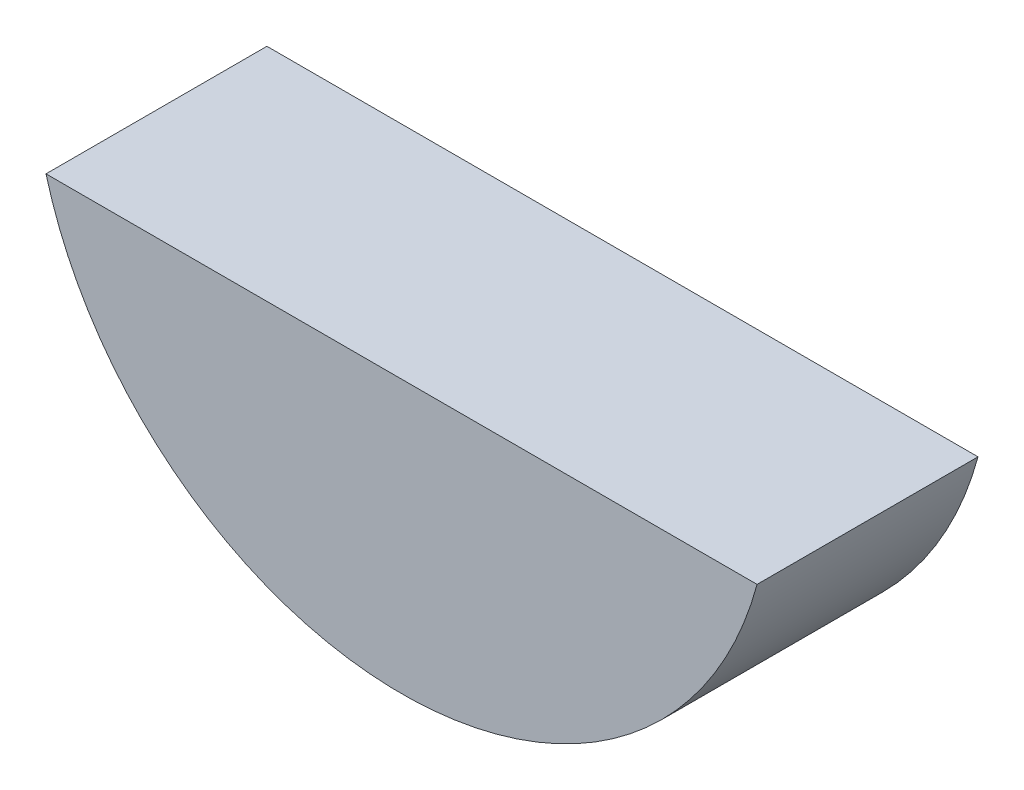
ISO-10303-21;
HEADER;
FILE_DESCRIPTION(('STEP AP214'),'2;1');
FILE_NAME('part.step','',(''),(''),'','','');
FILE_SCHEMA(('AUTOMOTIVE_DESIGN { 1 0 10303 214 1 1 1 1 }'));
ENDSEC;
DATA;
#1=APPLICATION_CONTEXT('core data for automotive mechanical design processes');
#2=APPLICATION_PROTOCOL_DEFINITION('international standard','automotive_design',2000,#1);
#3=PRODUCT_CONTEXT('',#1,'mechanical');
#4=PRODUCT('Part','Part','',(#3));
#5=PRODUCT_RELATED_PRODUCT_CATEGORY('part','',(#4));
#6=PRODUCT_DEFINITION_FORMATION('','',#4);
#7=PRODUCT_DEFINITION_CONTEXT('part definition',#1,'design');
#8=PRODUCT_DEFINITION('design','',#6,#7);
#9=PRODUCT_DEFINITION_SHAPE('','',#8);
#10=(LENGTH_UNIT() NAMED_UNIT(*) SI_UNIT(.MILLI.,.METRE.));
#11=(NAMED_UNIT(*) PLANE_ANGLE_UNIT() SI_UNIT($,.RADIAN.));
#12=(NAMED_UNIT(*) SI_UNIT($,.STERADIAN.) SOLID_ANGLE_UNIT());
#13=UNCERTAINTY_MEASURE_WITH_UNIT(LENGTH_MEASURE(1.E-05),#10,'distance_accuracy_value','');
#14=(GEOMETRIC_REPRESENTATION_CONTEXT(3) GLOBAL_UNCERTAINTY_ASSIGNED_CONTEXT((#13)) GLOBAL_UNIT_ASSIGNED_CONTEXT((#10,
#11,#12)) REPRESENTATION_CONTEXT('',''));
#15=CARTESIAN_POINT('',(0.,0.,0.));
#16=DIRECTION('',(0.,0.,1.));
#17=DIRECTION('',(1.,0.,0.));
#18=AXIS2_PLACEMENT_3D('',#15,#16,#17);
#19=CARTESIAN_POINT('',(0.,1.3,1.5));
#20=DIRECTION('',(0.,0.,-1.));
#21=DIRECTION('',(-1.,0.,0.));
#22=AXIS2_PLACEMENT_3D('',#19,#20,#21);
#23=CYLINDRICAL_SURFACE('',#22,5.);
#24=CARTESIAN_POINT('',(0.,1.3,-1.5));
#25=DIRECTION('',(0.,0.,1.));
#26=DIRECTION('',(1.,0.,0.));
#27=AXIS2_PLACEMENT_3D('',#24,#25,#26);
#28=CIRCLE('',#27,5.);
#29=CARTESIAN_POINT('',(-4.82804308182932,0.,-1.5));
#30=VERTEX_POINT('',#29);
#31=CARTESIAN_POINT('',(4.82804308182932,0.,-1.5));
#32=VERTEX_POINT('',#31);
#33=EDGE_CURVE('E56',#30,#32,#28,.T.);
#34=ORIENTED_EDGE('',*,*,#33,.T.);
#35=DIRECTION('',(0.,0.,-1.));
#36=VECTOR('',#35,1.);
#37=CARTESIAN_POINT('',(4.82804308182932,0.,1.5));
#38=LINE('',#37,#36);
#39=CARTESIAN_POINT('',(4.82804308182932,0.,1.5));
#40=VERTEX_POINT('',#39);
#41=EDGE_CURVE('E11',#40,#32,#38,.T.);
#42=ORIENTED_EDGE('',*,*,#41,.F.);
#43=CARTESIAN_POINT('',(0.,1.3,1.5));
#44=DIRECTION('',(0.,0.,1.));
#45=DIRECTION('',(1.,0.,0.));
#46=AXIS2_PLACEMENT_3D('',#43,#44,#45);
#47=CIRCLE('',#46,5.);
#48=CARTESIAN_POINT('',(-4.82804308182932,0.,1.5));
#49=VERTEX_POINT('',#48);
#50=EDGE_CURVE('E58',#49,#40,#47,.T.);
#51=ORIENTED_EDGE('',*,*,#50,.F.);
#52=DIRECTION('',(0.,0.,-1.));
#53=VECTOR('',#52,1.);
#54=CARTESIAN_POINT('',(-4.82804308182932,0.,1.5));
#55=LINE('',#54,#53);
#56=EDGE_CURVE('E36',#49,#30,#55,.T.);
#57=ORIENTED_EDGE('',*,*,#56,.T.);
#58=EDGE_LOOP('',(#34,#42,#51,#57));
#59=FACE_BOUND('',#58,.T.);
#60=ADVANCED_FACE('F29',(#59),#23,.T.);
#61=CARTESIAN_POINT('',(-4.82804308182932,0.,1.5));
#62=DIRECTION('',(0.,-1.,0.));
#63=DIRECTION('',(0.,0.,-1.));
#64=AXIS2_PLACEMENT_3D('',#61,#62,#63);
#65=PLANE('',#64);
#66=DIRECTION('',(-1.,0.,0.));
#67=VECTOR('',#66,1.);
#68=CARTESIAN_POINT('',(-4.82804308182932,0.,-1.5));
#69=LINE('',#68,#67);
#70=EDGE_CURVE('E53',#32,#30,#69,.T.);
#71=ORIENTED_EDGE('',*,*,#70,.T.);
#72=ORIENTED_EDGE('',*,*,#56,.F.);
#73=DIRECTION('',(-1.,0.,0.));
#74=VECTOR('',#73,1.);
#75=CARTESIAN_POINT('',(-4.82804308182932,0.,1.5));
#76=LINE('',#75,#74);
#77=EDGE_CURVE('E42',#40,#49,#76,.T.);
#78=ORIENTED_EDGE('',*,*,#77,.F.);
#79=ORIENTED_EDGE('',*,*,#41,.T.);
#80=EDGE_LOOP('',(#71,#72,#78,#79));
#81=FACE_BOUND('',#80,.T.);
#82=ADVANCED_FACE('F61',(#81),#65,.F.);
#83=CARTESIAN_POINT('',(0.,1.3,1.5));
#84=DIRECTION('',(0.,0.,1.));
#85=DIRECTION('',(1.,0.,0.));
#86=AXIS2_PLACEMENT_3D('',#83,#84,#85);
#87=PLANE('',#86);
#88=ORIENTED_EDGE('',*,*,#50,.T.);
#89=ORIENTED_EDGE('',*,*,#77,.T.);
#90=EDGE_LOOP('',(#88,#89));
#91=FACE_BOUND('',#90,.T.);
#92=ADVANCED_FACE('F67',(#91),#87,.T.);
#93=CARTESIAN_POINT('',(0.,1.3,-1.5));
#94=DIRECTION('',(0.,0.,1.));
#95=DIRECTION('',(1.,0.,0.));
#96=AXIS2_PLACEMENT_3D('',#93,#94,#95);
#97=PLANE('',#96);
#98=ORIENTED_EDGE('',*,*,#33,.F.);
#99=ORIENTED_EDGE('',*,*,#70,.F.);
#100=EDGE_LOOP('',(#98,#99));
#101=FACE_BOUND('',#100,.T.);
#102=ADVANCED_FACE('F54',(#101),#97,.F.);
#103=CLOSED_SHELL('',(#60,#82,#92,#102));
#104=MANIFOLD_SOLID_BREP('B2',#103);
#105=ADVANCED_BREP_SHAPE_REPRESENTATION('',(#18,#104),#14);
#106=SHAPE_DEFINITION_REPRESENTATION(#9,#105);
ENDSEC;
END-ISO-10303-21;
